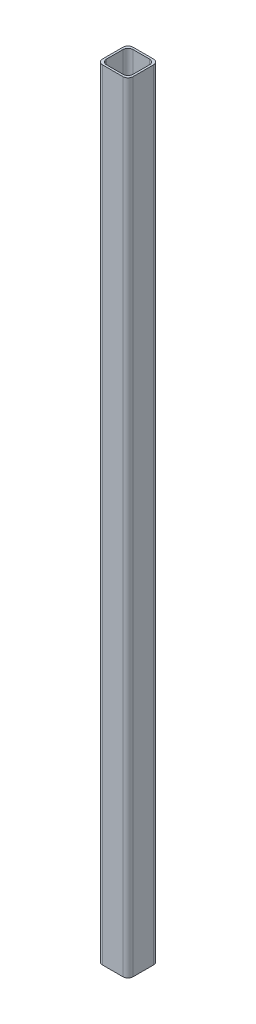
ISO-10303-21;
HEADER;
FILE_DESCRIPTION(('STEP AP214'),'2;1');
FILE_NAME('part.step','',(''),(''),'','','');
FILE_SCHEMA(('AUTOMOTIVE_DESIGN { 1 0 10303 214 1 1 1 1 }'));
ENDSEC;
DATA;
#1=APPLICATION_CONTEXT('core data for automotive mechanical design processes');
#2=APPLICATION_PROTOCOL_DEFINITION('international standard','automotive_design',2000,#1);
#3=PRODUCT_CONTEXT('',#1,'mechanical');
#4=PRODUCT('Part','Part','',(#3));
#5=PRODUCT_RELATED_PRODUCT_CATEGORY('part','',(#4));
#6=PRODUCT_DEFINITION_FORMATION('','',#4);
#7=PRODUCT_DEFINITION_CONTEXT('part definition',#1,'design');
#8=PRODUCT_DEFINITION('design','',#6,#7);
#9=PRODUCT_DEFINITION_SHAPE('','',#8);
#10=(LENGTH_UNIT() NAMED_UNIT(*) SI_UNIT(.MILLI.,.METRE.));
#11=(NAMED_UNIT(*) PLANE_ANGLE_UNIT() SI_UNIT($,.RADIAN.));
#12=(NAMED_UNIT(*) SI_UNIT($,.STERADIAN.) SOLID_ANGLE_UNIT());
#13=UNCERTAINTY_MEASURE_WITH_UNIT(LENGTH_MEASURE(1.E-05),#10,'distance_accuracy_value','');
#14=(GEOMETRIC_REPRESENTATION_CONTEXT(3) GLOBAL_UNCERTAINTY_ASSIGNED_CONTEXT((#13)) GLOBAL_UNIT_ASSIGNED_CONTEXT((#10,
#11,#12)) REPRESENTATION_CONTEXT('',''));
#15=CARTESIAN_POINT('',(0.,0.,0.));
#16=DIRECTION('',(0.,0.,1.));
#17=DIRECTION('',(1.,0.,0.));
#18=AXIS2_PLACEMENT_3D('',#15,#16,#17);
#19=CARTESIAN_POINT('',(20.,1530.,-20.));
#20=DIRECTION('',(0.,-1.,0.));
#21=DIRECTION('',(0.,0.,-1.));
#22=AXIS2_PLACEMENT_3D('',#19,#20,#21);
#23=PLANE('',#22);
#24=CARTESIAN_POINT('',(20.,1530.,-20.));
#25=DIRECTION('',(0.,1.,0.));
#26=DIRECTION('',(0.,0.,-1.));
#27=AXIS2_PLACEMENT_3D('',#24,#25,#26);
#28=CIRCLE('',#27,10.);
#29=CARTESIAN_POINT('',(30.,1530.,-19.9999999999999));
#30=VERTEX_POINT('',#29);
#31=CARTESIAN_POINT('',(19.9999999999999,1530.,-30.));
#32=VERTEX_POINT('',#31);
#33=EDGE_CURVE('E213',#30,#32,#28,.T.);
#34=ORIENTED_EDGE('',*,*,#33,.T.);
#35=DIRECTION('',(-1.,0.,0.));
#36=VECTOR('',#35,1.);
#37=CARTESIAN_POINT('',(-19.9999999999999,1530.,-30.));
#38=LINE('',#37,#36);
#39=CARTESIAN_POINT('',(-19.9999999999999,1530.,-30.));
#40=VERTEX_POINT('',#39);
#41=EDGE_CURVE('E216',#32,#40,#38,.T.);
#42=ORIENTED_EDGE('',*,*,#41,.T.);
#43=CARTESIAN_POINT('',(-20.,1530.,-20.));
#44=DIRECTION('',(0.,1.,0.));
#45=DIRECTION('',(0.,0.,1.));
#46=AXIS2_PLACEMENT_3D('',#43,#44,#45);
#47=CIRCLE('',#46,10.);
#48=CARTESIAN_POINT('',(-30.,1530.,-19.9999999999999));
#49=VERTEX_POINT('',#48);
#50=EDGE_CURVE('E219',#40,#49,#47,.T.);
#51=ORIENTED_EDGE('',*,*,#50,.T.);
#52=DIRECTION('',(0.,0.,1.));
#53=VECTOR('',#52,1.);
#54=CARTESIAN_POINT('',(-30.,1530.,-19.9999999999999));
#55=LINE('',#54,#53);
#56=CARTESIAN_POINT('',(-30.,1530.,19.9999999999999));
#57=VERTEX_POINT('',#56);
#58=EDGE_CURVE('E221',#49,#57,#55,.T.);
#59=ORIENTED_EDGE('',*,*,#58,.T.);
#60=CARTESIAN_POINT('',(-20.,1530.,20.));
#61=DIRECTION('',(0.,1.,0.));
#62=DIRECTION('',(0.,0.,1.));
#63=AXIS2_PLACEMENT_3D('',#60,#61,#62);
#64=CIRCLE('',#63,10.);
#65=CARTESIAN_POINT('',(-20.,1530.,30.));
#66=VERTEX_POINT('',#65);
#67=EDGE_CURVE('E223',#57,#66,#64,.T.);
#68=ORIENTED_EDGE('',*,*,#67,.T.);
#69=DIRECTION('',(1.,0.,0.));
#70=VECTOR('',#69,1.);
#71=CARTESIAN_POINT('',(-19.9999999999999,1530.,30.));
#72=LINE('',#71,#70);
#73=CARTESIAN_POINT('',(19.9999999999999,1530.,30.));
#74=VERTEX_POINT('',#73);
#75=EDGE_CURVE('E225',#66,#74,#72,.T.);
#76=ORIENTED_EDGE('',*,*,#75,.T.);
#77=CARTESIAN_POINT('',(20.,1530.,20.));
#78=DIRECTION('',(0.,1.,0.));
#79=DIRECTION('',(0.,0.,1.));
#80=AXIS2_PLACEMENT_3D('',#77,#78,#79);
#81=CIRCLE('',#80,10.);
#82=CARTESIAN_POINT('',(30.,1530.,19.9999999999999));
#83=VERTEX_POINT('',#82);
#84=EDGE_CURVE('E227',#74,#83,#81,.T.);
#85=ORIENTED_EDGE('',*,*,#84,.T.);
#86=DIRECTION('',(0.,0.,-1.));
#87=VECTOR('',#86,1.);
#88=CARTESIAN_POINT('',(30.,1530.,-19.9999999999999));
#89=LINE('',#88,#87);
#90=EDGE_CURVE('E229',#83,#30,#89,.T.);
#91=ORIENTED_EDGE('',*,*,#90,.T.);
#92=EDGE_LOOP('',(#34,#42,#51,#59,#68,#76,#85,#91));
#93=FACE_BOUND('',#92,.T.);
#94=CARTESIAN_POINT('',(16.,1530.,16.));
#95=DIRECTION('',(0.,1.,0.));
#96=DIRECTION('',(0.,0.,1.));
#97=AXIS2_PLACEMENT_3D('',#94,#95,#96);
#98=CIRCLE('',#97,10.);
#99=CARTESIAN_POINT('',(15.9999999999999,1530.,26.));
#100=VERTEX_POINT('',#99);
#101=CARTESIAN_POINT('',(26.,1530.,15.9999999999999));
#102=VERTEX_POINT('',#101);
#103=EDGE_CURVE('E148',#100,#102,#98,.T.);
#104=ORIENTED_EDGE('',*,*,#103,.F.);
#105=DIRECTION('',(1.,0.,0.));
#106=VECTOR('',#105,1.);
#107=CARTESIAN_POINT('',(-15.9999999999999,1530.,26.));
#108=LINE('',#107,#106);
#109=CARTESIAN_POINT('',(-15.9999999999999,1530.,26.));
#110=VERTEX_POINT('',#109);
#111=EDGE_CURVE('E181',#110,#100,#108,.T.);
#112=ORIENTED_EDGE('',*,*,#111,.F.);
#113=CARTESIAN_POINT('',(-16.,1530.,16.));
#114=DIRECTION('',(0.,1.,0.));
#115=DIRECTION('',(0.,0.,1.));
#116=AXIS2_PLACEMENT_3D('',#113,#114,#115);
#117=CIRCLE('',#116,10.);
#118=CARTESIAN_POINT('',(-26.,1530.,15.9999999999999));
#119=VERTEX_POINT('',#118);
#120=EDGE_CURVE('E179',#119,#110,#117,.T.);
#121=ORIENTED_EDGE('',*,*,#120,.F.);
#122=DIRECTION('',(0.,0.,1.));
#123=VECTOR('',#122,1.);
#124=CARTESIAN_POINT('',(-26.,1530.,-15.9999999999999));
#125=LINE('',#124,#123);
#126=CARTESIAN_POINT('',(-26.,1530.,-15.9999999999999));
#127=VERTEX_POINT('',#126);
#128=EDGE_CURVE('E177',#127,#119,#125,.T.);
#129=ORIENTED_EDGE('',*,*,#128,.F.);
#130=CARTESIAN_POINT('',(-16.,1530.,-16.));
#131=DIRECTION('',(0.,1.,0.));
#132=DIRECTION('',(0.,0.,1.));
#133=AXIS2_PLACEMENT_3D('',#130,#131,#132);
#134=CIRCLE('',#133,10.);
#135=CARTESIAN_POINT('',(-15.9999999999999,1530.,-26.));
#136=VERTEX_POINT('',#135);
#137=EDGE_CURVE('E175',#136,#127,#134,.T.);
#138=ORIENTED_EDGE('',*,*,#137,.F.);
#139=DIRECTION('',(-1.,0.,0.));
#140=VECTOR('',#139,1.);
#141=CARTESIAN_POINT('',(-15.9999999999999,1530.,-26.));
#142=LINE('',#141,#140);
#143=CARTESIAN_POINT('',(15.9999999999999,1530.,-26.));
#144=VERTEX_POINT('',#143);
#145=EDGE_CURVE('E171',#144,#136,#142,.T.);
#146=ORIENTED_EDGE('',*,*,#145,.F.);
#147=CARTESIAN_POINT('',(16.,1530.,-16.));
#148=DIRECTION('',(0.,1.,0.));
#149=DIRECTION('',(0.,0.,-1.));
#150=AXIS2_PLACEMENT_3D('',#147,#148,#149);
#151=CIRCLE('',#150,10.);
#152=CARTESIAN_POINT('',(26.,1530.,-15.9999999999999));
#153=VERTEX_POINT('',#152);
#154=EDGE_CURVE('E169',#153,#144,#151,.T.);
#155=ORIENTED_EDGE('',*,*,#154,.F.);
#156=DIRECTION('',(0.,0.,-1.));
#157=VECTOR('',#156,1.);
#158=CARTESIAN_POINT('',(26.,1530.,-15.9999999999999));
#159=LINE('',#158,#157);
#160=EDGE_CURVE('E156',#102,#153,#159,.T.);
#161=ORIENTED_EDGE('',*,*,#160,.F.);
#162=EDGE_LOOP('',(#104,#112,#121,#129,#138,#146,#155,#161));
#163=FACE_BOUND('',#162,.T.);
#164=ADVANCED_FACE('F35',(#93,#163),#23,.F.);
#165=CARTESIAN_POINT('',(20.,0.,-20.));
#166=DIRECTION('',(0.,-1.,0.));
#167=DIRECTION('',(0.,0.,-1.));
#168=AXIS2_PLACEMENT_3D('',#165,#166,#167);
#169=PLANE('',#168);
#170=CARTESIAN_POINT('',(20.,0.,-20.));
#171=DIRECTION('',(0.,1.,0.));
#172=DIRECTION('',(0.,0.,-1.));
#173=AXIS2_PLACEMENT_3D('',#170,#171,#172);
#174=CIRCLE('',#173,10.);
#175=CARTESIAN_POINT('',(30.,0.,-19.9999999999999));
#176=VERTEX_POINT('',#175);
#177=CARTESIAN_POINT('',(19.9999999999999,0.,-30.));
#178=VERTEX_POINT('',#177);
#179=EDGE_CURVE('E164',#176,#178,#174,.T.);
#180=ORIENTED_EDGE('',*,*,#179,.F.);
#181=DIRECTION('',(0.,0.,-1.));
#182=VECTOR('',#181,1.);
#183=CARTESIAN_POINT('',(30.,0.,-19.9999999999999));
#184=LINE('',#183,#182);
#185=CARTESIAN_POINT('',(30.,0.,19.9999999999999));
#186=VERTEX_POINT('',#185);
#187=EDGE_CURVE('E217',#186,#176,#184,.T.);
#188=ORIENTED_EDGE('',*,*,#187,.F.);
#189=CARTESIAN_POINT('',(20.,0.,20.));
#190=DIRECTION('',(0.,1.,0.));
#191=DIRECTION('',(0.,0.,1.));
#192=AXIS2_PLACEMENT_3D('',#189,#190,#191);
#193=CIRCLE('',#192,10.);
#194=CARTESIAN_POINT('',(19.9999999999999,0.,30.));
#195=VERTEX_POINT('',#194);
#196=EDGE_CURVE('E244',#195,#186,#193,.T.);
#197=ORIENTED_EDGE('',*,*,#196,.F.);
#198=DIRECTION('',(1.,0.,0.));
#199=VECTOR('',#198,1.);
#200=CARTESIAN_POINT('',(-19.9999999999999,0.,30.));
#201=LINE('',#200,#199);
#202=CARTESIAN_POINT('',(-20.,0.,30.));
#203=VERTEX_POINT('',#202);
#204=EDGE_CURVE('E242',#203,#195,#201,.T.);
#205=ORIENTED_EDGE('',*,*,#204,.F.);
#206=CARTESIAN_POINT('',(-20.,0.,20.));
#207=DIRECTION('',(0.,1.,0.));
#208=DIRECTION('',(0.,0.,1.));
#209=AXIS2_PLACEMENT_3D('',#206,#207,#208);
#210=CIRCLE('',#209,10.);
#211=CARTESIAN_POINT('',(-30.,0.,19.9999999999999));
#212=VERTEX_POINT('',#211);
#213=EDGE_CURVE('E240',#212,#203,#210,.T.);
#214=ORIENTED_EDGE('',*,*,#213,.F.);
#215=DIRECTION('',(0.,0.,1.));
#216=VECTOR('',#215,1.);
#217=CARTESIAN_POINT('',(-30.,0.,-19.9999999999999));
#218=LINE('',#217,#216);
#219=CARTESIAN_POINT('',(-30.,0.,-19.9999999999999));
#220=VERTEX_POINT('',#219);
#221=EDGE_CURVE('E238',#220,#212,#218,.T.);
#222=ORIENTED_EDGE('',*,*,#221,.F.);
#223=CARTESIAN_POINT('',(-20.,0.,-20.));
#224=DIRECTION('',(0.,1.,0.));
#225=DIRECTION('',(0.,0.,1.));
#226=AXIS2_PLACEMENT_3D('',#223,#224,#225);
#227=CIRCLE('',#226,10.);
#228=CARTESIAN_POINT('',(-19.9999999999999,0.,-30.));
#229=VERTEX_POINT('',#228);
#230=EDGE_CURVE('E236',#229,#220,#227,.T.);
#231=ORIENTED_EDGE('',*,*,#230,.F.);
#232=DIRECTION('',(-1.,0.,0.));
#233=VECTOR('',#232,1.);
#234=CARTESIAN_POINT('',(-19.9999999999999,0.,-30.));
#235=LINE('',#234,#233);
#236=EDGE_CURVE('E234',#178,#229,#235,.T.);
#237=ORIENTED_EDGE('',*,*,#236,.F.);
#238=EDGE_LOOP('',(#180,#188,#197,#205,#214,#222,#231,#237));
#239=FACE_BOUND('',#238,.T.);
#240=DIRECTION('',(1.,0.,0.));
#241=VECTOR('',#240,1.);
#242=CARTESIAN_POINT('',(-15.9999999999999,0.,26.));
#243=LINE('',#242,#241);
#244=CARTESIAN_POINT('',(-15.9999999999999,0.,26.));
#245=VERTEX_POINT('',#244);
#246=CARTESIAN_POINT('',(15.9999999999999,0.,26.));
#247=VERTEX_POINT('',#246);
#248=EDGE_CURVE('E157',#245,#247,#243,.T.);
#249=ORIENTED_EDGE('',*,*,#248,.T.);
#250=CARTESIAN_POINT('',(16.,0.,16.));
#251=DIRECTION('',(0.,1.,0.));
#252=DIRECTION('',(0.,0.,1.));
#253=AXIS2_PLACEMENT_3D('',#250,#251,#252);
#254=CIRCLE('',#253,10.);
#255=CARTESIAN_POINT('',(26.,0.,15.9999999999999));
#256=VERTEX_POINT('',#255);
#257=EDGE_CURVE('E58',#247,#256,#254,.T.);
#258=ORIENTED_EDGE('',*,*,#257,.T.);
#259=DIRECTION('',(0.,0.,-1.));
#260=VECTOR('',#259,1.);
#261=CARTESIAN_POINT('',(26.,0.,-15.9999999999999));
#262=LINE('',#261,#260);
#263=CARTESIAN_POINT('',(26.,0.,-15.9999999999999));
#264=VERTEX_POINT('',#263);
#265=EDGE_CURVE('E163',#256,#264,#262,.T.);
#266=ORIENTED_EDGE('',*,*,#265,.T.);
#267=CARTESIAN_POINT('',(16.,0.,-16.));
#268=DIRECTION('',(0.,1.,0.));
#269=DIRECTION('',(0.,0.,-1.));
#270=AXIS2_PLACEMENT_3D('',#267,#268,#269);
#271=CIRCLE('',#270,10.);
#272=CARTESIAN_POINT('',(15.9999999999999,0.,-26.));
#273=VERTEX_POINT('',#272);
#274=EDGE_CURVE('E185',#264,#273,#271,.T.);
#275=ORIENTED_EDGE('',*,*,#274,.T.);
#276=DIRECTION('',(-1.,0.,0.));
#277=VECTOR('',#276,1.);
#278=CARTESIAN_POINT('',(-15.9999999999999,0.,-26.));
#279=LINE('',#278,#277);
#280=CARTESIAN_POINT('',(-15.9999999999999,0.,-26.));
#281=VERTEX_POINT('',#280);
#282=EDGE_CURVE('E188',#273,#281,#279,.T.);
#283=ORIENTED_EDGE('',*,*,#282,.T.);
#284=CARTESIAN_POINT('',(-16.,0.,-16.));
#285=DIRECTION('',(0.,1.,0.));
#286=DIRECTION('',(0.,0.,1.));
#287=AXIS2_PLACEMENT_3D('',#284,#285,#286);
#288=CIRCLE('',#287,10.);
#289=CARTESIAN_POINT('',(-26.,0.,-15.9999999999999));
#290=VERTEX_POINT('',#289);
#291=EDGE_CURVE('E191',#281,#290,#288,.T.);
#292=ORIENTED_EDGE('',*,*,#291,.T.);
#293=DIRECTION('',(0.,0.,1.));
#294=VECTOR('',#293,1.);
#295=CARTESIAN_POINT('',(-26.,0.,-15.9999999999999));
#296=LINE('',#295,#294);
#297=CARTESIAN_POINT('',(-26.,0.,15.9999999999999));
#298=VERTEX_POINT('',#297);
#299=EDGE_CURVE('E194',#290,#298,#296,.T.);
#300=ORIENTED_EDGE('',*,*,#299,.T.);
#301=CARTESIAN_POINT('',(-16.,0.,16.));
#302=DIRECTION('',(0.,1.,0.));
#303=DIRECTION('',(0.,0.,1.));
#304=AXIS2_PLACEMENT_3D('',#301,#302,#303);
#305=CIRCLE('',#304,10.);
#306=EDGE_CURVE('E197',#298,#245,#305,.T.);
#307=ORIENTED_EDGE('',*,*,#306,.T.);
#308=EDGE_LOOP('',(#249,#258,#266,#275,#283,#292,#300,#307));
#309=FACE_BOUND('',#308,.T.);
#310=ADVANCED_FACE('F274',(#239,#309),#169,.T.);
#311=CARTESIAN_POINT('',(20.,1530.,-20.));
#312=DIRECTION('',(0.,-1.,0.));
#313=DIRECTION('',(0.,0.,-1.));
#314=AXIS2_PLACEMENT_3D('',#311,#312,#313);
#315=CYLINDRICAL_SURFACE('',#314,10.);
#316=ORIENTED_EDGE('',*,*,#179,.T.);
#317=DIRECTION('',(0.,-1.,0.));
#318=VECTOR('',#317,1.);
#319=CARTESIAN_POINT('',(19.9999999999999,1530.,-30.));
#320=LINE('',#319,#318);
#321=EDGE_CURVE('E11',#32,#178,#320,.T.);
#322=ORIENTED_EDGE('',*,*,#321,.F.);
#323=ORIENTED_EDGE('',*,*,#33,.F.);
#324=DIRECTION('',(0.,-1.,0.));
#325=VECTOR('',#324,1.);
#326=CARTESIAN_POINT('',(30.,1530.,-19.9999999999999));
#327=LINE('',#326,#325);
#328=EDGE_CURVE('E231',#30,#176,#327,.T.);
#329=ORIENTED_EDGE('',*,*,#328,.T.);
#330=EDGE_LOOP('',(#316,#322,#323,#329));
#331=FACE_BOUND('',#330,.T.);
#332=ADVANCED_FACE('F37',(#331),#315,.T.);
#333=CARTESIAN_POINT('',(-19.9999999999999,1530.,-30.));
#334=DIRECTION('',(0.,0.,1.));
#335=DIRECTION('',(1.,0.,0.));
#336=AXIS2_PLACEMENT_3D('',#333,#334,#335);
#337=PLANE('',#336);
#338=ORIENTED_EDGE('',*,*,#236,.T.);
#339=DIRECTION('',(0.,-1.,0.));
#340=VECTOR('',#339,1.);
#341=CARTESIAN_POINT('',(-19.9999999999999,1530.,-30.));
#342=LINE('',#341,#340);
#343=EDGE_CURVE('E43',#40,#229,#342,.T.);
#344=ORIENTED_EDGE('',*,*,#343,.F.);
#345=ORIENTED_EDGE('',*,*,#41,.F.);
#346=ORIENTED_EDGE('',*,*,#321,.T.);
#347=EDGE_LOOP('',(#338,#344,#345,#346));
#348=FACE_BOUND('',#347,.T.);
#349=ADVANCED_FACE('F291',(#348),#337,.F.);
#350=CARTESIAN_POINT('',(-20.,1530.,-20.));
#351=DIRECTION('',(0.,-1.,0.));
#352=DIRECTION('',(0.,0.,-1.));
#353=AXIS2_PLACEMENT_3D('',#350,#351,#352);
#354=CYLINDRICAL_SURFACE('',#353,10.);
#355=ORIENTED_EDGE('',*,*,#230,.T.);
#356=DIRECTION('',(0.,-1.,0.));
#357=VECTOR('',#356,1.);
#358=CARTESIAN_POINT('',(-30.,1530.,-19.9999999999999));
#359=LINE('',#358,#357);
#360=EDGE_CURVE('E261',#49,#220,#359,.T.);
#361=ORIENTED_EDGE('',*,*,#360,.F.);
#362=ORIENTED_EDGE('',*,*,#50,.F.);
#363=ORIENTED_EDGE('',*,*,#343,.T.);
#364=EDGE_LOOP('',(#355,#361,#362,#363));
#365=FACE_BOUND('',#364,.T.);
#366=ADVANCED_FACE('F268',(#365),#354,.T.);
#367=CARTESIAN_POINT('',(-30.,1530.,-19.9999999999999));
#368=DIRECTION('',(1.,0.,0.));
#369=DIRECTION('',(0.,0.,-1.));
#370=AXIS2_PLACEMENT_3D('',#367,#368,#369);
#371=PLANE('',#370);
#372=ORIENTED_EDGE('',*,*,#221,.T.);
#373=DIRECTION('',(0.,-1.,0.));
#374=VECTOR('',#373,1.);
#375=CARTESIAN_POINT('',(-30.,1530.,19.9999999999999));
#376=LINE('',#375,#374);
#377=EDGE_CURVE('E258',#57,#212,#376,.T.);
#378=ORIENTED_EDGE('',*,*,#377,.F.);
#379=ORIENTED_EDGE('',*,*,#58,.F.);
#380=ORIENTED_EDGE('',*,*,#360,.T.);
#381=EDGE_LOOP('',(#372,#378,#379,#380));
#382=FACE_BOUND('',#381,.T.);
#383=ADVANCED_FACE('F280',(#382),#371,.F.);
#384=CARTESIAN_POINT('',(-20.,1530.,20.));
#385=DIRECTION('',(0.,-1.,0.));
#386=DIRECTION('',(0.,0.,-1.));
#387=AXIS2_PLACEMENT_3D('',#384,#385,#386);
#388=CYLINDRICAL_SURFACE('',#387,10.);
#389=ORIENTED_EDGE('',*,*,#213,.T.);
#390=DIRECTION('',(0.,-1.,0.));
#391=VECTOR('',#390,1.);
#392=CARTESIAN_POINT('',(-20.,1530.,30.));
#393=LINE('',#392,#391);
#394=EDGE_CURVE('E255',#66,#203,#393,.T.);
#395=ORIENTED_EDGE('',*,*,#394,.F.);
#396=ORIENTED_EDGE('',*,*,#67,.F.);
#397=ORIENTED_EDGE('',*,*,#377,.T.);
#398=EDGE_LOOP('',(#389,#395,#396,#397));
#399=FACE_BOUND('',#398,.T.);
#400=ADVANCED_FACE('F284',(#399),#388,.T.);
#401=CARTESIAN_POINT('',(-19.9999999999999,1530.,30.));
#402=DIRECTION('',(0.,0.,-1.));
#403=DIRECTION('',(-1.,0.,0.));
#404=AXIS2_PLACEMENT_3D('',#401,#402,#403);
#405=PLANE('',#404);
#406=ORIENTED_EDGE('',*,*,#204,.T.);
#407=DIRECTION('',(0.,-1.,0.));
#408=VECTOR('',#407,1.);
#409=CARTESIAN_POINT('',(19.9999999999999,1530.,30.));
#410=LINE('',#409,#408);
#411=EDGE_CURVE('E252',#74,#195,#410,.T.);
#412=ORIENTED_EDGE('',*,*,#411,.F.);
#413=ORIENTED_EDGE('',*,*,#75,.F.);
#414=ORIENTED_EDGE('',*,*,#394,.T.);
#415=EDGE_LOOP('',(#406,#412,#413,#414));
#416=FACE_BOUND('',#415,.T.);
#417=ADVANCED_FACE('F304',(#416),#405,.F.);
#418=CARTESIAN_POINT('',(20.,1530.,20.));
#419=DIRECTION('',(0.,-1.,0.));
#420=DIRECTION('',(0.,0.,-1.));
#421=AXIS2_PLACEMENT_3D('',#418,#419,#420);
#422=CYLINDRICAL_SURFACE('',#421,10.);
#423=ORIENTED_EDGE('',*,*,#196,.T.);
#424=DIRECTION('',(0.,-1.,0.));
#425=VECTOR('',#424,1.);
#426=CARTESIAN_POINT('',(30.,1530.,19.9999999999999));
#427=LINE('',#426,#425);
#428=EDGE_CURVE('E249',#83,#186,#427,.T.);
#429=ORIENTED_EDGE('',*,*,#428,.F.);
#430=ORIENTED_EDGE('',*,*,#84,.F.);
#431=ORIENTED_EDGE('',*,*,#411,.T.);
#432=EDGE_LOOP('',(#423,#429,#430,#431));
#433=FACE_BOUND('',#432,.T.);
#434=ADVANCED_FACE('F302',(#433),#422,.T.);
#435=CARTESIAN_POINT('',(30.,1530.,-19.9999999999999));
#436=DIRECTION('',(-1.,0.,0.));
#437=DIRECTION('',(0.,0.,1.));
#438=AXIS2_PLACEMENT_3D('',#435,#436,#437);
#439=PLANE('',#438);
#440=ORIENTED_EDGE('',*,*,#187,.T.);
#441=ORIENTED_EDGE('',*,*,#328,.F.);
#442=ORIENTED_EDGE('',*,*,#90,.F.);
#443=ORIENTED_EDGE('',*,*,#428,.T.);
#444=EDGE_LOOP('',(#440,#441,#442,#443));
#445=FACE_BOUND('',#444,.T.);
#446=ADVANCED_FACE('F297',(#445),#439,.F.);
#447=CARTESIAN_POINT('',(16.,1530.,16.));
#448=DIRECTION('',(0.,-1.,0.));
#449=DIRECTION('',(0.,0.,-1.));
#450=AXIS2_PLACEMENT_3D('',#447,#448,#449);
#451=CYLINDRICAL_SURFACE('',#450,10.);
#452=ORIENTED_EDGE('',*,*,#257,.F.);
#453=DIRECTION('',(0.,-1.,0.));
#454=VECTOR('',#453,1.);
#455=CARTESIAN_POINT('',(15.9999999999999,1530.,26.));
#456=LINE('',#455,#454);
#457=EDGE_CURVE('E152',#100,#247,#456,.T.);
#458=ORIENTED_EDGE('',*,*,#457,.F.);
#459=ORIENTED_EDGE('',*,*,#103,.T.);
#460=DIRECTION('',(0.,-1.,0.));
#461=VECTOR('',#460,1.);
#462=CARTESIAN_POINT('',(26.,1530.,15.9999999999999));
#463=LINE('',#462,#461);
#464=EDGE_CURVE('E151',#102,#256,#463,.T.);
#465=ORIENTED_EDGE('',*,*,#464,.T.);
#466=EDGE_LOOP('',(#452,#458,#459,#465));
#467=FACE_BOUND('',#466,.T.);
#468=ADVANCED_FACE('F150',(#467),#451,.F.);
#469=CARTESIAN_POINT('',(26.,1530.,-15.9999999999999));
#470=DIRECTION('',(-1.,0.,0.));
#471=DIRECTION('',(0.,0.,1.));
#472=AXIS2_PLACEMENT_3D('',#469,#470,#471);
#473=PLANE('',#472);
#474=ORIENTED_EDGE('',*,*,#265,.F.);
#475=ORIENTED_EDGE('',*,*,#464,.F.);
#476=ORIENTED_EDGE('',*,*,#160,.T.);
#477=DIRECTION('',(0.,-1.,0.));
#478=VECTOR('',#477,1.);
#479=CARTESIAN_POINT('',(26.,1530.,-15.9999999999999));
#480=LINE('',#479,#478);
#481=EDGE_CURVE('E165',#153,#264,#480,.T.);
#482=ORIENTED_EDGE('',*,*,#481,.T.);
#483=EDGE_LOOP('',(#474,#475,#476,#482));
#484=FACE_BOUND('',#483,.T.);
#485=ADVANCED_FACE('F160',(#484),#473,.T.);
#486=CARTESIAN_POINT('',(16.,1530.,-16.));
#487=DIRECTION('',(0.,-1.,0.));
#488=DIRECTION('',(0.,0.,-1.));
#489=AXIS2_PLACEMENT_3D('',#486,#487,#488);
#490=CYLINDRICAL_SURFACE('',#489,10.);
#491=ORIENTED_EDGE('',*,*,#274,.F.);
#492=ORIENTED_EDGE('',*,*,#481,.F.);
#493=ORIENTED_EDGE('',*,*,#154,.T.);
#494=DIRECTION('',(0.,-1.,0.));
#495=VECTOR('',#494,1.);
#496=CARTESIAN_POINT('',(15.9999999999999,1530.,-26.));
#497=LINE('',#496,#495);
#498=EDGE_CURVE('E210',#144,#273,#497,.T.);
#499=ORIENTED_EDGE('',*,*,#498,.T.);
#500=EDGE_LOOP('',(#491,#492,#493,#499));
#501=FACE_BOUND('',#500,.T.);
#502=ADVANCED_FACE('F329',(#501),#490,.F.);
#503=CARTESIAN_POINT('',(-15.9999999999999,1530.,-26.));
#504=DIRECTION('',(0.,0.,1.));
#505=DIRECTION('',(1.,0.,0.));
#506=AXIS2_PLACEMENT_3D('',#503,#504,#505);
#507=PLANE('',#506);
#508=ORIENTED_EDGE('',*,*,#282,.F.);
#509=ORIENTED_EDGE('',*,*,#498,.F.);
#510=ORIENTED_EDGE('',*,*,#145,.T.);
#511=DIRECTION('',(0.,-1.,0.));
#512=VECTOR('',#511,1.);
#513=CARTESIAN_POINT('',(-15.9999999999999,1530.,-26.));
#514=LINE('',#513,#512);
#515=EDGE_CURVE('E208',#136,#281,#514,.T.);
#516=ORIENTED_EDGE('',*,*,#515,.T.);
#517=EDGE_LOOP('',(#508,#509,#510,#516));
#518=FACE_BOUND('',#517,.T.);
#519=ADVANCED_FACE('F333',(#518),#507,.T.);
#520=CARTESIAN_POINT('',(-16.,1530.,-16.));
#521=DIRECTION('',(0.,-1.,0.));
#522=DIRECTION('',(0.,0.,-1.));
#523=AXIS2_PLACEMENT_3D('',#520,#521,#522);
#524=CYLINDRICAL_SURFACE('',#523,10.);
#525=ORIENTED_EDGE('',*,*,#291,.F.);
#526=ORIENTED_EDGE('',*,*,#515,.F.);
#527=ORIENTED_EDGE('',*,*,#137,.T.);
#528=DIRECTION('',(0.,-1.,0.));
#529=VECTOR('',#528,1.);
#530=CARTESIAN_POINT('',(-26.,1530.,-15.9999999999999));
#531=LINE('',#530,#529);
#532=EDGE_CURVE('E206',#127,#290,#531,.T.);
#533=ORIENTED_EDGE('',*,*,#532,.T.);
#534=EDGE_LOOP('',(#525,#526,#527,#533));
#535=FACE_BOUND('',#534,.T.);
#536=ADVANCED_FACE('F339',(#535),#524,.F.);
#537=CARTESIAN_POINT('',(-26.,1530.,-15.9999999999999));
#538=DIRECTION('',(1.,0.,0.));
#539=DIRECTION('',(0.,0.,-1.));
#540=AXIS2_PLACEMENT_3D('',#537,#538,#539);
#541=PLANE('',#540);
#542=ORIENTED_EDGE('',*,*,#299,.F.);
#543=ORIENTED_EDGE('',*,*,#532,.F.);
#544=ORIENTED_EDGE('',*,*,#128,.T.);
#545=DIRECTION('',(0.,-1.,0.));
#546=VECTOR('',#545,1.);
#547=CARTESIAN_POINT('',(-26.,1530.,15.9999999999999));
#548=LINE('',#547,#546);
#549=EDGE_CURVE('E204',#119,#298,#548,.T.);
#550=ORIENTED_EDGE('',*,*,#549,.T.);
#551=EDGE_LOOP('',(#542,#543,#544,#550));
#552=FACE_BOUND('',#551,.T.);
#553=ADVANCED_FACE('F343',(#552),#541,.T.);
#554=CARTESIAN_POINT('',(-16.,1530.,16.));
#555=DIRECTION('',(0.,-1.,0.));
#556=DIRECTION('',(0.,0.,-1.));
#557=AXIS2_PLACEMENT_3D('',#554,#555,#556);
#558=CYLINDRICAL_SURFACE('',#557,10.);
#559=ORIENTED_EDGE('',*,*,#306,.F.);
#560=ORIENTED_EDGE('',*,*,#549,.F.);
#561=ORIENTED_EDGE('',*,*,#120,.T.);
#562=DIRECTION('',(0.,-1.,0.));
#563=VECTOR('',#562,1.);
#564=CARTESIAN_POINT('',(-15.9999999999999,1530.,26.));
#565=LINE('',#564,#563);
#566=EDGE_CURVE('E50',#110,#245,#565,.T.);
#567=ORIENTED_EDGE('',*,*,#566,.T.);
#568=EDGE_LOOP('',(#559,#560,#561,#567));
#569=FACE_BOUND('',#568,.T.);
#570=ADVANCED_FACE('F347',(#569),#558,.F.);
#571=CARTESIAN_POINT('',(-15.9999999999999,1530.,26.));
#572=DIRECTION('',(0.,0.,-1.));
#573=DIRECTION('',(-1.,0.,0.));
#574=AXIS2_PLACEMENT_3D('',#571,#572,#573);
#575=PLANE('',#574);
#576=ORIENTED_EDGE('',*,*,#248,.F.);
#577=ORIENTED_EDGE('',*,*,#566,.F.);
#578=ORIENTED_EDGE('',*,*,#111,.T.);
#579=ORIENTED_EDGE('',*,*,#457,.T.);
#580=EDGE_LOOP('',(#576,#577,#578,#579));
#581=FACE_BOUND('',#580,.T.);
#582=ADVANCED_FACE('F351',(#581),#575,.T.);
#583=CLOSED_SHELL('',(#164,#310,#332,#349,#366,#383,#400,#417,#434,#446,#468,#485,#502,#519,
#536,#553,#570,#582));
#584=MANIFOLD_SOLID_BREP('B2',#583);
#585=ADVANCED_BREP_SHAPE_REPRESENTATION('',(#18,#584),#14);
#586=SHAPE_DEFINITION_REPRESENTATION(#9,#585);
ENDSEC;
END-ISO-10303-21;
